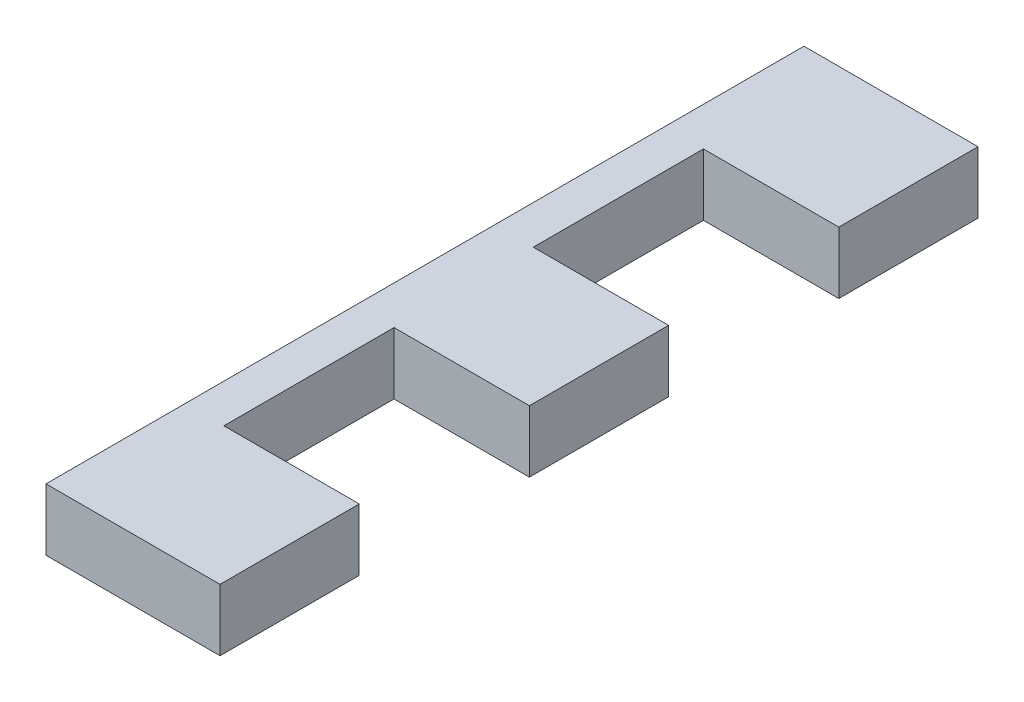
ISO-10303-21;
HEADER;
FILE_DESCRIPTION(('STEP AP214'),'2;1');
FILE_NAME('part.step','',(''),(''),'','','');
FILE_SCHEMA(('AUTOMOTIVE_DESIGN { 1 0 10303 214 1 1 1 1 }'));
ENDSEC;
DATA;
#1=APPLICATION_CONTEXT('core data for automotive mechanical design processes');
#2=APPLICATION_PROTOCOL_DEFINITION('international standard','automotive_design',2000,#1);
#3=PRODUCT_CONTEXT('',#1,'mechanical');
#4=PRODUCT('Part','Part','',(#3));
#5=PRODUCT_RELATED_PRODUCT_CATEGORY('part','',(#4));
#6=PRODUCT_DEFINITION_FORMATION('','',#4);
#7=PRODUCT_DEFINITION_CONTEXT('part definition',#1,'design');
#8=PRODUCT_DEFINITION('design','',#6,#7);
#9=PRODUCT_DEFINITION_SHAPE('','',#8);
#10=(LENGTH_UNIT() NAMED_UNIT(*) SI_UNIT(.MILLI.,.METRE.));
#11=(NAMED_UNIT(*) PLANE_ANGLE_UNIT() SI_UNIT($,.RADIAN.));
#12=(NAMED_UNIT(*) SI_UNIT($,.STERADIAN.) SOLID_ANGLE_UNIT());
#13=UNCERTAINTY_MEASURE_WITH_UNIT(LENGTH_MEASURE(1.E-05),#10,'distance_accuracy_value','');
#14=(GEOMETRIC_REPRESENTATION_CONTEXT(3) GLOBAL_UNCERTAINTY_ASSIGNED_CONTEXT((#13)) GLOBAL_UNIT_ASSIGNED_CONTEXT((#10,
#11,#12)) REPRESENTATION_CONTEXT('',''));
#15=CARTESIAN_POINT('',(0.,0.,0.));
#16=DIRECTION('',(0.,0.,1.));
#17=DIRECTION('',(1.,0.,0.));
#18=AXIS2_PLACEMENT_3D('',#15,#16,#17);
#19=CARTESIAN_POINT('',(0.,0.,0.));
#20=DIRECTION('',(-1.,0.,0.));
#21=DIRECTION('',(0.,0.,1.));
#22=AXIS2_PLACEMENT_3D('',#19,#20,#21);
#23=PLANE('',#22);
#24=DIRECTION('',(0.,-1.,0.));
#25=VECTOR('',#24,1.);
#26=CARTESIAN_POINT('',(0.,0.,-6.2));
#27=LINE('',#26,#25);
#28=CARTESIAN_POINT('',(0.,0.8,-6.2));
#29=VERTEX_POINT('',#28);
#30=CARTESIAN_POINT('',(0.,-0.800000000000001,-6.2));
#31=VERTEX_POINT('',#30);
#32=EDGE_CURVE('E160',#29,#31,#27,.T.);
#33=ORIENTED_EDGE('',*,*,#32,.F.);
#34=DIRECTION('',(0.,0.,-1.));
#35=VECTOR('',#34,1.);
#36=CARTESIAN_POINT('',(0.,0.8,-9.8));
#37=LINE('',#36,#35);
#38=CARTESIAN_POINT('',(0.,0.8,-1.8));
#39=VERTEX_POINT('',#38);
#40=EDGE_CURVE('E58',#39,#29,#37,.T.);
#41=ORIENTED_EDGE('',*,*,#40,.F.);
#42=DIRECTION('',(0.,1.,0.));
#43=VECTOR('',#42,1.);
#44=CARTESIAN_POINT('',(0.,0.,-1.8));
#45=LINE('',#44,#43);
#46=CARTESIAN_POINT('',(0.,-0.800000000000001,-1.8));
#47=VERTEX_POINT('',#46);
#48=EDGE_CURVE('E170',#47,#39,#45,.T.);
#49=ORIENTED_EDGE('',*,*,#48,.F.);
#50=DIRECTION('',(0.,0.,1.));
#51=VECTOR('',#50,1.);
#52=CARTESIAN_POINT('',(0.,-0.800000000000001,-9.8));
#53=LINE('',#52,#51);
#54=EDGE_CURVE('E204',#31,#47,#53,.T.);
#55=ORIENTED_EDGE('',*,*,#54,.F.);
#56=EDGE_LOOP('',(#33,#41,#49,#55));
#57=FACE_BOUND('',#56,.T.);
#58=ADVANCED_FACE('F43',(#57),#23,.F.);
#59=DIRECTION('',(0.,-1.,0.));
#60=VECTOR('',#59,1.);
#61=CARTESIAN_POINT('',(0.,0.,1.8));
#62=LINE('',#61,#60);
#63=CARTESIAN_POINT('',(0.,0.8,1.8));
#64=VERTEX_POINT('',#63);
#65=CARTESIAN_POINT('',(0.,-0.800000000000001,1.8));
#66=VERTEX_POINT('',#65);
#67=EDGE_CURVE('E66',#64,#66,#62,.T.);
#68=ORIENTED_EDGE('',*,*,#67,.F.);
#69=CARTESIAN_POINT('',(0.,0.799999999999999,6.2));
#70=VERTEX_POINT('',#69);
#71=EDGE_CURVE('E197',#70,#64,#37,.T.);
#72=ORIENTED_EDGE('',*,*,#71,.F.);
#73=DIRECTION('',(0.,1.,0.));
#74=VECTOR('',#73,1.);
#75=CARTESIAN_POINT('',(0.,0.,6.2));
#76=LINE('',#75,#74);
#77=CARTESIAN_POINT('',(0.,-0.800000000000001,6.2));
#78=VERTEX_POINT('',#77);
#79=EDGE_CURVE('E208',#78,#70,#76,.T.);
#80=ORIENTED_EDGE('',*,*,#79,.F.);
#81=EDGE_CURVE('E194',#66,#78,#53,.T.);
#82=ORIENTED_EDGE('',*,*,#81,.F.);
#83=EDGE_LOOP('',(#68,#72,#80,#82));
#84=FACE_BOUND('',#83,.T.);
#85=ADVANCED_FACE('F234',(#84),#23,.F.);
#86=CARTESIAN_POINT('',(3.5,0.,9.8));
#87=DIRECTION('',(0.,0.,-1.));
#88=DIRECTION('',(-1.,0.,0.));
#89=AXIS2_PLACEMENT_3D('',#86,#87,#88);
#90=PLANE('',#89);
#91=DIRECTION('',(-1.,0.,0.));
#92=VECTOR('',#91,1.);
#93=CARTESIAN_POINT('',(3.5,0.799999999999999,9.8));
#94=LINE('',#93,#92);
#95=CARTESIAN_POINT('',(3.5,0.799999999999999,9.8));
#96=VERTEX_POINT('',#95);
#97=CARTESIAN_POINT('',(-1.,0.8,9.8));
#98=VERTEX_POINT('',#97);
#99=EDGE_CURVE('E218',#96,#98,#94,.T.);
#100=ORIENTED_EDGE('',*,*,#99,.T.);
#101=DIRECTION('',(0.,1.,0.));
#102=VECTOR('',#101,1.);
#103=CARTESIAN_POINT('',(-1.,0.8,9.8));
#104=LINE('',#103,#102);
#105=CARTESIAN_POINT('',(-1.,-0.800000000000001,9.8));
#106=VERTEX_POINT('',#105);
#107=EDGE_CURVE('E200',#106,#98,#104,.T.);
#108=ORIENTED_EDGE('',*,*,#107,.F.);
#109=DIRECTION('',(-1.,0.,0.));
#110=VECTOR('',#109,1.);
#111=CARTESIAN_POINT('',(3.5,-0.800000000000001,9.8));
#112=LINE('',#111,#110);
#113=CARTESIAN_POINT('',(3.5,-0.800000000000001,9.8));
#114=VERTEX_POINT('',#113);
#115=EDGE_CURVE('E11',#114,#106,#112,.T.);
#116=ORIENTED_EDGE('',*,*,#115,.F.);
#117=DIRECTION('',(0.,-1.,0.));
#118=VECTOR('',#117,1.);
#119=CARTESIAN_POINT('',(3.5,0.,9.8));
#120=LINE('',#119,#118);
#121=EDGE_CURVE('E209',#96,#114,#120,.T.);
#122=ORIENTED_EDGE('',*,*,#121,.F.);
#123=EDGE_LOOP('',(#100,#108,#116,#122));
#124=FACE_BOUND('',#123,.T.);
#125=ADVANCED_FACE('F45',(#124),#90,.F.);
#126=CARTESIAN_POINT('',(3.5,-0.800000000000001,0.));
#127=DIRECTION('',(0.,1.,0.));
#128=DIRECTION('',(0.,0.,1.));
#129=AXIS2_PLACEMENT_3D('',#126,#127,#128);
#130=PLANE('',#129);
#131=ORIENTED_EDGE('',*,*,#115,.T.);
#132=DIRECTION('',(0.,0.,1.));
#133=VECTOR('',#132,1.);
#134=CARTESIAN_POINT('',(-1.,-0.800000000000001,-9.8));
#135=LINE('',#134,#133);
#136=CARTESIAN_POINT('',(-1.,-0.800000000000001,-9.8));
#137=VERTEX_POINT('',#136);
#138=EDGE_CURVE('E196',#137,#106,#135,.T.);
#139=ORIENTED_EDGE('',*,*,#138,.F.);
#140=DIRECTION('',(1.,0.,0.));
#141=VECTOR('',#140,1.);
#142=CARTESIAN_POINT('',(-1.,-0.800000000000001,-9.8));
#143=LINE('',#142,#141);
#144=CARTESIAN_POINT('',(3.5,-0.800000000000001,-9.8));
#145=VERTEX_POINT('',#144);
#146=EDGE_CURVE('E144',#137,#145,#143,.T.);
#147=ORIENTED_EDGE('',*,*,#146,.T.);
#148=DIRECTION('',(0.,0.,-1.));
#149=VECTOR('',#148,1.);
#150=CARTESIAN_POINT('',(3.5,-0.800000000000001,0.));
#151=LINE('',#150,#149);
#152=CARTESIAN_POINT('',(3.5,-0.800000000000001,-6.2));
#153=VERTEX_POINT('',#152);
#154=EDGE_CURVE('E159',#153,#145,#151,.T.);
#155=ORIENTED_EDGE('',*,*,#154,.F.);
#156=DIRECTION('',(-1.,0.,0.));
#157=VECTOR('',#156,1.);
#158=CARTESIAN_POINT('',(3.5,-0.800000000000001,-6.2));
#159=LINE('',#158,#157);
#160=EDGE_CURVE('E165',#153,#31,#159,.T.);
#161=ORIENTED_EDGE('',*,*,#160,.T.);
#162=ORIENTED_EDGE('',*,*,#54,.T.);
#163=DIRECTION('',(-1.,0.,0.));
#164=VECTOR('',#163,1.);
#165=CARTESIAN_POINT('',(3.5,-0.800000000000001,-1.8));
#166=LINE('',#165,#164);
#167=CARTESIAN_POINT('',(3.5,-0.800000000000001,-1.8));
#168=VERTEX_POINT('',#167);
#169=EDGE_CURVE('E191',#168,#47,#166,.T.);
#170=ORIENTED_EDGE('',*,*,#169,.F.);
#171=DIRECTION('',(0.,0.,-1.));
#172=VECTOR('',#171,1.);
#173=CARTESIAN_POINT('',(3.5,-0.800000000000001,0.));
#174=LINE('',#173,#172);
#175=CARTESIAN_POINT('',(3.5,-0.800000000000001,1.8));
#176=VERTEX_POINT('',#175);
#177=EDGE_CURVE('E171',#176,#168,#174,.T.);
#178=ORIENTED_EDGE('',*,*,#177,.F.);
#179=DIRECTION('',(-1.,0.,0.));
#180=VECTOR('',#179,1.);
#181=CARTESIAN_POINT('',(3.5,-0.800000000000001,1.8));
#182=LINE('',#181,#180);
#183=EDGE_CURVE('E180',#176,#66,#182,.T.);
#184=ORIENTED_EDGE('',*,*,#183,.T.);
#185=ORIENTED_EDGE('',*,*,#81,.T.);
#186=DIRECTION('',(-1.,0.,0.));
#187=VECTOR('',#186,1.);
#188=CARTESIAN_POINT('',(3.5,-0.800000000000001,6.2));
#189=LINE('',#188,#187);
#190=CARTESIAN_POINT('',(3.5,-0.800000000000001,6.2));
#191=VERTEX_POINT('',#190);
#192=EDGE_CURVE('E51',#191,#78,#189,.T.);
#193=ORIENTED_EDGE('',*,*,#192,.F.);
#194=DIRECTION('',(0.,0.,-1.));
#195=VECTOR('',#194,1.);
#196=CARTESIAN_POINT('',(3.5,-0.800000000000001,0.));
#197=LINE('',#196,#195);
#198=EDGE_CURVE('E212',#114,#191,#197,.T.);
#199=ORIENTED_EDGE('',*,*,#198,.F.);
#200=EDGE_LOOP('',(#131,#139,#147,#155,#161,#162,#170,#178,#184,#185,#193,#199));
#201=FACE_BOUND('',#200,.T.);
#202=ADVANCED_FACE('F231',(#201),#130,.F.);
#203=CARTESIAN_POINT('',(3.5,0.,6.2));
#204=DIRECTION('',(0.,0.,1.));
#205=DIRECTION('',(1.,0.,0.));
#206=AXIS2_PLACEMENT_3D('',#203,#204,#205);
#207=PLANE('',#206);
#208=ORIENTED_EDGE('',*,*,#79,.T.);
#209=DIRECTION('',(-1.,0.,0.));
#210=VECTOR('',#209,1.);
#211=CARTESIAN_POINT('',(3.5,0.799999999999999,6.2));
#212=LINE('',#211,#210);
#213=CARTESIAN_POINT('',(3.5,0.799999999999999,6.2));
#214=VERTEX_POINT('',#213);
#215=EDGE_CURVE('E222',#214,#70,#212,.T.);
#216=ORIENTED_EDGE('',*,*,#215,.F.);
#217=DIRECTION('',(0.,1.,0.));
#218=VECTOR('',#217,1.);
#219=CARTESIAN_POINT('',(3.5,0.,6.2));
#220=LINE('',#219,#218);
#221=EDGE_CURVE('E214',#191,#214,#220,.T.);
#222=ORIENTED_EDGE('',*,*,#221,.F.);
#223=ORIENTED_EDGE('',*,*,#192,.T.);
#224=EDGE_LOOP('',(#208,#216,#222,#223));
#225=FACE_BOUND('',#224,.T.);
#226=ADVANCED_FACE('F227',(#225),#207,.F.);
#227=CARTESIAN_POINT('',(3.5,0.8,0.));
#228=DIRECTION('',(0.,-1.,0.));
#229=DIRECTION('',(0.,0.,-1.));
#230=AXIS2_PLACEMENT_3D('',#227,#228,#229);
#231=PLANE('',#230);
#232=ORIENTED_EDGE('',*,*,#215,.T.);
#233=ORIENTED_EDGE('',*,*,#71,.T.);
#234=DIRECTION('',(-1.,0.,0.));
#235=VECTOR('',#234,1.);
#236=CARTESIAN_POINT('',(3.5,0.8,1.8));
#237=LINE('',#236,#235);
#238=CARTESIAN_POINT('',(3.5,0.8,1.8));
#239=VERTEX_POINT('',#238);
#240=EDGE_CURVE('E185',#239,#64,#237,.T.);
#241=ORIENTED_EDGE('',*,*,#240,.F.);
#242=DIRECTION('',(0.,0.,1.));
#243=VECTOR('',#242,1.);
#244=CARTESIAN_POINT('',(3.5,0.8,0.));
#245=LINE('',#244,#243);
#246=CARTESIAN_POINT('',(3.5,0.8,-1.8));
#247=VERTEX_POINT('',#246);
#248=EDGE_CURVE('E176',#247,#239,#245,.T.);
#249=ORIENTED_EDGE('',*,*,#248,.F.);
#250=DIRECTION('',(-1.,0.,0.));
#251=VECTOR('',#250,1.);
#252=CARTESIAN_POINT('',(3.5,0.8,-1.8));
#253=LINE('',#252,#251);
#254=EDGE_CURVE('E188',#247,#39,#253,.T.);
#255=ORIENTED_EDGE('',*,*,#254,.T.);
#256=ORIENTED_EDGE('',*,*,#40,.T.);
#257=DIRECTION('',(-1.,0.,0.));
#258=VECTOR('',#257,1.);
#259=CARTESIAN_POINT('',(3.5,0.8,-6.2));
#260=LINE('',#259,#258);
#261=CARTESIAN_POINT('',(3.5,0.8,-6.2));
#262=VERTEX_POINT('',#261);
#263=EDGE_CURVE('E151',#262,#29,#260,.T.);
#264=ORIENTED_EDGE('',*,*,#263,.F.);
#265=DIRECTION('',(0.,0.,1.));
#266=VECTOR('',#265,1.);
#267=CARTESIAN_POINT('',(3.5,0.799999999999999,0.));
#268=LINE('',#267,#266);
#269=CARTESIAN_POINT('',(3.5,0.8,-9.8));
#270=VERTEX_POINT('',#269);
#271=EDGE_CURVE('E148',#270,#262,#268,.T.);
#272=ORIENTED_EDGE('',*,*,#271,.F.);
#273=DIRECTION('',(1.,0.,0.));
#274=VECTOR('',#273,1.);
#275=CARTESIAN_POINT('',(-1.,0.8,-9.8));
#276=LINE('',#275,#274);
#277=CARTESIAN_POINT('',(-1.,0.8,-9.8));
#278=VERTEX_POINT('',#277);
#279=EDGE_CURVE('E134',#278,#270,#276,.T.);
#280=ORIENTED_EDGE('',*,*,#279,.F.);
#281=DIRECTION('',(0.,0.,-1.));
#282=VECTOR('',#281,1.);
#283=CARTESIAN_POINT('',(-1.,0.8,-9.8));
#284=LINE('',#283,#282);
#285=EDGE_CURVE('E145',#98,#278,#284,.T.);
#286=ORIENTED_EDGE('',*,*,#285,.F.);
#287=ORIENTED_EDGE('',*,*,#99,.F.);
#288=DIRECTION('',(0.,0.,1.));
#289=VECTOR('',#288,1.);
#290=CARTESIAN_POINT('',(3.5,0.8,0.));
#291=LINE('',#290,#289);
#292=EDGE_CURVE('E216',#214,#96,#291,.T.);
#293=ORIENTED_EDGE('',*,*,#292,.F.);
#294=EDGE_LOOP('',(#232,#233,#241,#249,#255,#256,#264,#272,#280,#286,#287,#293));
#295=FACE_BOUND('',#294,.T.);
#296=ADVANCED_FACE('F150',(#295),#231,.F.);
#297=CARTESIAN_POINT('',(3.5,0.,0.));
#298=DIRECTION('',(1.,0.,0.));
#299=DIRECTION('',(0.,0.,-1.));
#300=AXIS2_PLACEMENT_3D('',#297,#298,#299);
#301=PLANE('',#300);
#302=ORIENTED_EDGE('',*,*,#121,.T.);
#303=ORIENTED_EDGE('',*,*,#198,.T.);
#304=ORIENTED_EDGE('',*,*,#221,.T.);
#305=ORIENTED_EDGE('',*,*,#292,.T.);
#306=EDGE_LOOP('',(#302,#303,#304,#305));
#307=FACE_BOUND('',#306,.T.);
#308=ADVANCED_FACE('F271',(#307),#301,.T.);
#309=CARTESIAN_POINT('',(-1.,0.8,-9.8));
#310=DIRECTION('',(0.,0.,1.));
#311=DIRECTION('',(1.,0.,0.));
#312=AXIS2_PLACEMENT_3D('',#309,#310,#311);
#313=PLANE('',#312);
#314=ORIENTED_EDGE('',*,*,#279,.T.);
#315=DIRECTION('',(0.,1.,0.));
#316=VECTOR('',#315,1.);
#317=CARTESIAN_POINT('',(3.5,0.,-9.8));
#318=LINE('',#317,#316);
#319=EDGE_CURVE('E139',#145,#270,#318,.T.);
#320=ORIENTED_EDGE('',*,*,#319,.F.);
#321=ORIENTED_EDGE('',*,*,#146,.F.);
#322=DIRECTION('',(0.,-1.,0.));
#323=VECTOR('',#322,1.);
#324=CARTESIAN_POINT('',(-1.,0.8,-9.8));
#325=LINE('',#324,#323);
#326=EDGE_CURVE('E141',#278,#137,#325,.T.);
#327=ORIENTED_EDGE('',*,*,#326,.F.);
#328=EDGE_LOOP('',(#314,#320,#321,#327));
#329=FACE_BOUND('',#328,.T.);
#330=ADVANCED_FACE('F136',(#329),#313,.F.);
#331=CARTESIAN_POINT('',(-1.,0.,0.));
#332=DIRECTION('',(-1.,0.,0.));
#333=DIRECTION('',(0.,0.,1.));
#334=AXIS2_PLACEMENT_3D('',#331,#332,#333);
#335=PLANE('',#334);
#336=ORIENTED_EDGE('',*,*,#326,.T.);
#337=ORIENTED_EDGE('',*,*,#138,.T.);
#338=ORIENTED_EDGE('',*,*,#107,.T.);
#339=ORIENTED_EDGE('',*,*,#285,.T.);
#340=EDGE_LOOP('',(#336,#337,#338,#339));
#341=FACE_BOUND('',#340,.T.);
#342=ADVANCED_FACE('F267',(#341),#335,.T.);
#343=CARTESIAN_POINT('',(3.5,0.,-1.8));
#344=DIRECTION('',(0.,0.,1.));
#345=DIRECTION('',(1.,0.,0.));
#346=AXIS2_PLACEMENT_3D('',#343,#344,#345);
#347=PLANE('',#346);
#348=ORIENTED_EDGE('',*,*,#48,.T.);
#349=ORIENTED_EDGE('',*,*,#254,.F.);
#350=DIRECTION('',(0.,1.,0.));
#351=VECTOR('',#350,1.);
#352=CARTESIAN_POINT('',(3.5,0.,-1.8));
#353=LINE('',#352,#351);
#354=EDGE_CURVE('E174',#168,#247,#353,.T.);
#355=ORIENTED_EDGE('',*,*,#354,.F.);
#356=ORIENTED_EDGE('',*,*,#169,.T.);
#357=EDGE_LOOP('',(#348,#349,#355,#356));
#358=FACE_BOUND('',#357,.T.);
#359=ADVANCED_FACE('F246',(#358),#347,.F.);
#360=CARTESIAN_POINT('',(3.5,0.,1.8));
#361=DIRECTION('',(0.,0.,-1.));
#362=DIRECTION('',(-1.,0.,0.));
#363=AXIS2_PLACEMENT_3D('',#360,#361,#362);
#364=PLANE('',#363);
#365=ORIENTED_EDGE('',*,*,#67,.T.);
#366=ORIENTED_EDGE('',*,*,#183,.F.);
#367=DIRECTION('',(0.,-1.,0.));
#368=VECTOR('',#367,1.);
#369=CARTESIAN_POINT('',(3.5,0.,1.8));
#370=LINE('',#369,#368);
#371=EDGE_CURVE('E178',#239,#176,#370,.T.);
#372=ORIENTED_EDGE('',*,*,#371,.F.);
#373=ORIENTED_EDGE('',*,*,#240,.T.);
#374=EDGE_LOOP('',(#365,#366,#372,#373));
#375=FACE_BOUND('',#374,.T.);
#376=ADVANCED_FACE('F240',(#375),#364,.F.);
#377=CARTESIAN_POINT('',(3.5,0.,0.));
#378=DIRECTION('',(1.,0.,0.));
#379=DIRECTION('',(0.,0.,-1.));
#380=AXIS2_PLACEMENT_3D('',#377,#378,#379);
#381=PLANE('',#380);
#382=ORIENTED_EDGE('',*,*,#177,.T.);
#383=ORIENTED_EDGE('',*,*,#354,.T.);
#384=ORIENTED_EDGE('',*,*,#248,.T.);
#385=ORIENTED_EDGE('',*,*,#371,.T.);
#386=EDGE_LOOP('',(#382,#383,#384,#385));
#387=FACE_BOUND('',#386,.T.);
#388=ADVANCED_FACE('F242',(#387),#381,.T.);
#389=CARTESIAN_POINT('',(3.5,0.,-6.2));
#390=DIRECTION('',(0.,0.,-1.));
#391=DIRECTION('',(-1.,0.,0.));
#392=AXIS2_PLACEMENT_3D('',#389,#390,#391);
#393=PLANE('',#392);
#394=ORIENTED_EDGE('',*,*,#32,.T.);
#395=ORIENTED_EDGE('',*,*,#160,.F.);
#396=DIRECTION('',(0.,-1.,0.));
#397=VECTOR('',#396,1.);
#398=CARTESIAN_POINT('',(3.5,0.,-6.2));
#399=LINE('',#398,#397);
#400=EDGE_CURVE('E154',#262,#153,#399,.T.);
#401=ORIENTED_EDGE('',*,*,#400,.F.);
#402=ORIENTED_EDGE('',*,*,#263,.T.);
#403=EDGE_LOOP('',(#394,#395,#401,#402));
#404=FACE_BOUND('',#403,.T.);
#405=ADVANCED_FACE('F250',(#404),#393,.F.);
#406=CARTESIAN_POINT('',(3.5,0.,0.));
#407=DIRECTION('',(1.,0.,0.));
#408=DIRECTION('',(0.,0.,-1.));
#409=AXIS2_PLACEMENT_3D('',#406,#407,#408);
#410=PLANE('',#409);
#411=ORIENTED_EDGE('',*,*,#319,.T.);
#412=ORIENTED_EDGE('',*,*,#271,.T.);
#413=ORIENTED_EDGE('',*,*,#400,.T.);
#414=ORIENTED_EDGE('',*,*,#154,.T.);
#415=EDGE_LOOP('',(#411,#412,#413,#414));
#416=FACE_BOUND('',#415,.T.);
#417=ADVANCED_FACE('F157',(#416),#410,.T.);
#418=CLOSED_SHELL('',(#58,#85,#125,#202,#226,#296,#308,#330,#342,#359,#376,#388,#405,#417));
#419=MANIFOLD_SOLID_BREP('B2',#418);
#420=ADVANCED_BREP_SHAPE_REPRESENTATION('',(#18,#419),#14);
#421=SHAPE_DEFINITION_REPRESENTATION(#9,#420);
ENDSEC;
END-ISO-10303-21;
